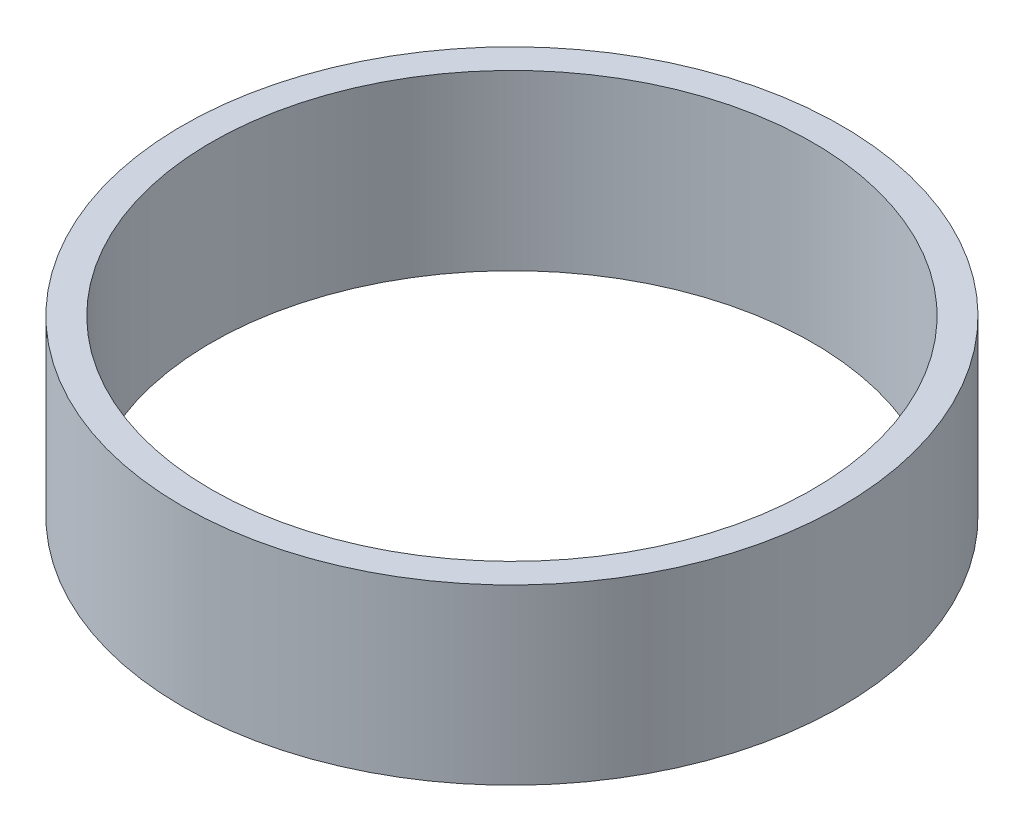
ISO-10303-21;
HEADER;
FILE_DESCRIPTION(('STEP AP214'),'2;1');
FILE_NAME('part.step','',(''),(''),'','','');
FILE_SCHEMA(('AUTOMOTIVE_DESIGN { 1 0 10303 214 1 1 1 1 }'));
ENDSEC;
DATA;
#1=APPLICATION_CONTEXT('core data for automotive mechanical design processes');
#2=APPLICATION_PROTOCOL_DEFINITION('international standard','automotive_design',2000,#1);
#3=PRODUCT_CONTEXT('',#1,'mechanical');
#4=PRODUCT('Part','Part','',(#3));
#5=PRODUCT_RELATED_PRODUCT_CATEGORY('part','',(#4));
#6=PRODUCT_DEFINITION_FORMATION('','',#4);
#7=PRODUCT_DEFINITION_CONTEXT('part definition',#1,'design');
#8=PRODUCT_DEFINITION('design','',#6,#7);
#9=PRODUCT_DEFINITION_SHAPE('','',#8);
#10=(LENGTH_UNIT() NAMED_UNIT(*) SI_UNIT(.MILLI.,.METRE.));
#11=(NAMED_UNIT(*) PLANE_ANGLE_UNIT() SI_UNIT($,.RADIAN.));
#12=(NAMED_UNIT(*) SI_UNIT($,.STERADIAN.) SOLID_ANGLE_UNIT());
#13=UNCERTAINTY_MEASURE_WITH_UNIT(LENGTH_MEASURE(1.E-05),#10,'distance_accuracy_value','');
#14=(GEOMETRIC_REPRESENTATION_CONTEXT(3) GLOBAL_UNCERTAINTY_ASSIGNED_CONTEXT((#13)) GLOBAL_UNIT_ASSIGNED_CONTEXT((#10,
#11,#12)) REPRESENTATION_CONTEXT('',''));
#15=CARTESIAN_POINT('',(0.,0.,0.));
#16=DIRECTION('',(0.,0.,1.));
#17=DIRECTION('',(1.,0.,0.));
#18=AXIS2_PLACEMENT_3D('',#15,#16,#17);
#19=CARTESIAN_POINT('',(0.,30.,0.));
#20=DIRECTION('',(0.,1.,0.));
#21=DIRECTION('',(0.,0.,1.));
#22=AXIS2_PLACEMENT_3D('',#19,#20,#21);
#23=PLANE('',#22);
#24=CARTESIAN_POINT('',(0.,30.,0.));
#25=DIRECTION('',(0.,1.,0.));
#26=DIRECTION('',(0.,0.,1.));
#27=AXIS2_PLACEMENT_3D('',#24,#25,#26);
#28=CIRCLE('',#27,57.);
#29=CARTESIAN_POINT('',(0.,30.,57.));
#30=VERTEX_POINT('',#29);
#31=EDGE_CURVE('E10',#30,#30,#28,.T.);
#32=ORIENTED_EDGE('',*,*,#31,.T.);
#33=EDGE_LOOP('',(#32));
#34=FACE_BOUND('',#33,.T.);
#35=CARTESIAN_POINT('',(0.,30.,0.));
#36=DIRECTION('',(0.,1.,0.));
#37=DIRECTION('',(0.,0.,1.));
#38=AXIS2_PLACEMENT_3D('',#35,#36,#37);
#39=CIRCLE('',#38,52.);
#40=CARTESIAN_POINT('',(0.,30.,52.));
#41=VERTEX_POINT('',#40);
#42=EDGE_CURVE('E50',#41,#41,#39,.T.);
#43=ORIENTED_EDGE('',*,*,#42,.F.);
#44=EDGE_LOOP('',(#43));
#45=FACE_BOUND('',#44,.T.);
#46=ADVANCED_FACE('F37',(#34,#45),#23,.T.);
#47=CARTESIAN_POINT('',(0.,0.,0.));
#48=DIRECTION('',(0.,1.,0.));
#49=DIRECTION('',(0.,0.,1.));
#50=AXIS2_PLACEMENT_3D('',#47,#48,#49);
#51=PLANE('',#50);
#52=CARTESIAN_POINT('',(0.,0.,0.));
#53=DIRECTION('',(0.,1.,0.));
#54=DIRECTION('',(0.,0.,1.));
#55=AXIS2_PLACEMENT_3D('',#52,#53,#54);
#56=CIRCLE('',#55,57.);
#57=CARTESIAN_POINT('',(0.,0.,57.));
#58=VERTEX_POINT('',#57);
#59=EDGE_CURVE('E41',#58,#58,#56,.T.);
#60=ORIENTED_EDGE('',*,*,#59,.F.);
#61=EDGE_LOOP('',(#60));
#62=FACE_BOUND('',#61,.T.);
#63=CARTESIAN_POINT('',(0.,0.,0.));
#64=DIRECTION('',(0.,1.,0.));
#65=DIRECTION('',(0.,0.,1.));
#66=AXIS2_PLACEMENT_3D('',#63,#64,#65);
#67=CIRCLE('',#66,52.);
#68=CARTESIAN_POINT('',(0.,0.,52.));
#69=VERTEX_POINT('',#68);
#70=EDGE_CURVE('E52',#69,#69,#67,.T.);
#71=ORIENTED_EDGE('',*,*,#70,.T.);
#72=EDGE_LOOP('',(#71));
#73=FACE_BOUND('',#72,.T.);
#74=ADVANCED_FACE('F64',(#62,#73),#51,.F.);
#75=CARTESIAN_POINT('',(0.,30.,0.));
#76=DIRECTION('',(0.,-1.,0.));
#77=DIRECTION('',(0.,0.,-1.));
#78=AXIS2_PLACEMENT_3D('',#75,#76,#77);
#79=CYLINDRICAL_SURFACE('',#78,57.);
#80=ORIENTED_EDGE('',*,*,#31,.F.);
#81=EDGE_LOOP('',(#80));
#82=FACE_BOUND('',#81,.T.);
#83=ORIENTED_EDGE('',*,*,#59,.T.);
#84=EDGE_LOOP('',(#83));
#85=FACE_BOUND('',#84,.T.);
#86=ADVANCED_FACE('F39',(#82,#85),#79,.T.);
#87=CARTESIAN_POINT('',(0.,30.,0.));
#88=DIRECTION('',(0.,-1.,0.));
#89=DIRECTION('',(0.,0.,-1.));
#90=AXIS2_PLACEMENT_3D('',#87,#88,#89);
#91=CYLINDRICAL_SURFACE('',#90,52.);
#92=ORIENTED_EDGE('',*,*,#42,.T.);
#93=EDGE_LOOP('',(#92));
#94=FACE_BOUND('',#93,.T.);
#95=ORIENTED_EDGE('',*,*,#70,.F.);
#96=EDGE_LOOP('',(#95));
#97=FACE_BOUND('',#96,.T.);
#98=ADVANCED_FACE('F60',(#94,#97),#91,.F.);
#99=CLOSED_SHELL('',(#46,#74,#86,#98));
#100=MANIFOLD_SOLID_BREP('B2',#99);
#101=ADVANCED_BREP_SHAPE_REPRESENTATION('',(#18,#100),#14);
#102=SHAPE_DEFINITION_REPRESENTATION(#9,#101);
ENDSEC;
END-ISO-10303-21;
